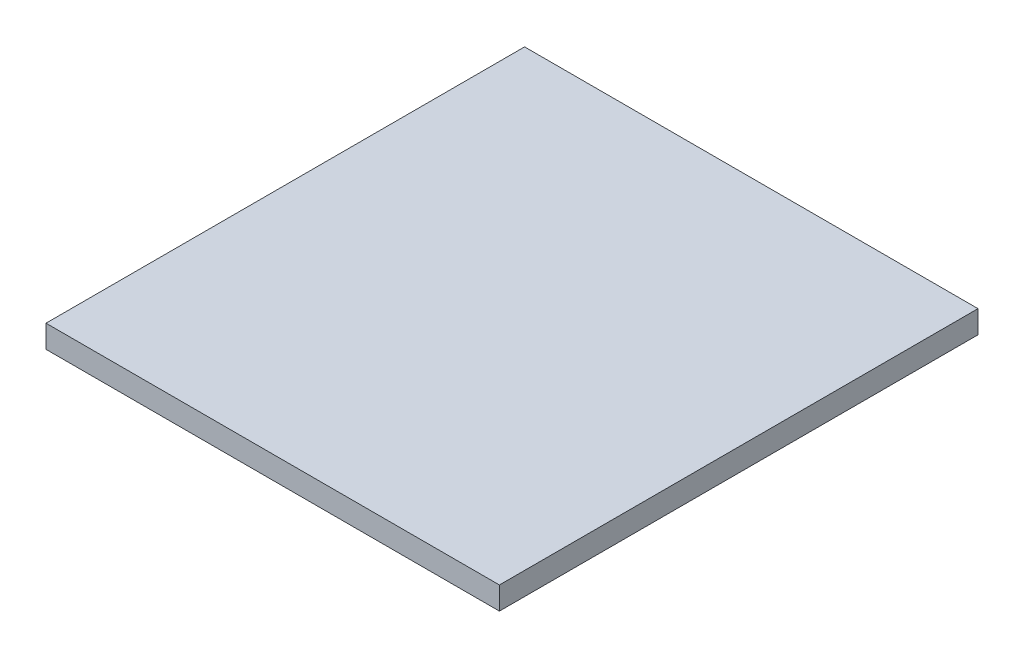
ISO-10303-21;
HEADER;
FILE_DESCRIPTION(('STEP AP214'),'2;1');
FILE_NAME('part.step','',(''),(''),'','','');
FILE_SCHEMA(('AUTOMOTIVE_DESIGN { 1 0 10303 214 1 1 1 1 }'));
ENDSEC;
DATA;
#1=APPLICATION_CONTEXT('core data for automotive mechanical design processes');
#2=APPLICATION_PROTOCOL_DEFINITION('international standard','automotive_design',2000,#1);
#3=PRODUCT_CONTEXT('',#1,'mechanical');
#4=PRODUCT('Part','Part','',(#3));
#5=PRODUCT_RELATED_PRODUCT_CATEGORY('part','',(#4));
#6=PRODUCT_DEFINITION_FORMATION('','',#4);
#7=PRODUCT_DEFINITION_CONTEXT('part definition',#1,'design');
#8=PRODUCT_DEFINITION('design','',#6,#7);
#9=PRODUCT_DEFINITION_SHAPE('','',#8);
#10=(LENGTH_UNIT() NAMED_UNIT(*) SI_UNIT(.MILLI.,.METRE.));
#11=(NAMED_UNIT(*) PLANE_ANGLE_UNIT() SI_UNIT($,.RADIAN.));
#12=(NAMED_UNIT(*) SI_UNIT($,.STERADIAN.) SOLID_ANGLE_UNIT());
#13=UNCERTAINTY_MEASURE_WITH_UNIT(LENGTH_MEASURE(1.E-05),#10,'distance_accuracy_value','');
#14=(GEOMETRIC_REPRESENTATION_CONTEXT(3) GLOBAL_UNCERTAINTY_ASSIGNED_CONTEXT((#13)) GLOBAL_UNIT_ASSIGNED_CONTEXT((#10,
#11,#12)) REPRESENTATION_CONTEXT('',''));
#15=CARTESIAN_POINT('',(0.,0.,0.));
#16=DIRECTION('',(0.,0.,1.));
#17=DIRECTION('',(1.,0.,0.));
#18=AXIS2_PLACEMENT_3D('',#15,#16,#17);
#19=CARTESIAN_POINT('',(180.,18.,-190.));
#20=DIRECTION('',(-1.,0.,0.));
#21=DIRECTION('',(0.,0.,1.));
#22=AXIS2_PLACEMENT_3D('',#19,#20,#21);
#23=PLANE('',#22);
#24=DIRECTION('',(0.,0.,-1.));
#25=VECTOR('',#24,1.);
#26=CARTESIAN_POINT('',(180.,0.,-190.));
#27=LINE('',#26,#25);
#28=CARTESIAN_POINT('',(180.,0.,190.));
#29=VERTEX_POINT('',#28);
#30=CARTESIAN_POINT('',(180.,0.,-190.));
#31=VERTEX_POINT('',#30);
#32=EDGE_CURVE('E95',#29,#31,#27,.T.);
#33=ORIENTED_EDGE('',*,*,#32,.T.);
#34=DIRECTION('',(0.,-1.,0.));
#35=VECTOR('',#34,1.);
#36=CARTESIAN_POINT('',(180.,18.,-190.));
#37=LINE('',#36,#35);
#38=CARTESIAN_POINT('',(180.,18.,-190.));
#39=VERTEX_POINT('',#38);
#40=EDGE_CURVE('E11',#39,#31,#37,.T.);
#41=ORIENTED_EDGE('',*,*,#40,.F.);
#42=DIRECTION('',(0.,0.,-1.));
#43=VECTOR('',#42,1.);
#44=CARTESIAN_POINT('',(180.,18.,-190.));
#45=LINE('',#44,#43);
#46=CARTESIAN_POINT('',(180.,18.,190.));
#47=VERTEX_POINT('',#46);
#48=EDGE_CURVE('E83',#47,#39,#45,.T.);
#49=ORIENTED_EDGE('',*,*,#48,.F.);
#50=DIRECTION('',(0.,-1.,0.));
#51=VECTOR('',#50,1.);
#52=CARTESIAN_POINT('',(180.,18.,190.));
#53=LINE('',#52,#51);
#54=EDGE_CURVE('E91',#47,#29,#53,.T.);
#55=ORIENTED_EDGE('',*,*,#54,.T.);
#56=EDGE_LOOP('',(#33,#41,#49,#55));
#57=FACE_BOUND('',#56,.T.);
#58=ADVANCED_FACE('F32',(#57),#23,.F.);
#59=CARTESIAN_POINT('',(-180.,18.,-190.));
#60=DIRECTION('',(0.,0.,1.));
#61=DIRECTION('',(1.,0.,0.));
#62=AXIS2_PLACEMENT_3D('',#59,#60,#61);
#63=PLANE('',#62);
#64=DIRECTION('',(-1.,0.,0.));
#65=VECTOR('',#64,1.);
#66=CARTESIAN_POINT('',(-180.,0.,-190.));
#67=LINE('',#66,#65);
#68=CARTESIAN_POINT('',(-180.,0.,-190.));
#69=VERTEX_POINT('',#68);
#70=EDGE_CURVE('E87',#31,#69,#67,.T.);
#71=ORIENTED_EDGE('',*,*,#70,.T.);
#72=DIRECTION('',(0.,-1.,0.));
#73=VECTOR('',#72,1.);
#74=CARTESIAN_POINT('',(-180.,18.,-190.));
#75=LINE('',#74,#73);
#76=CARTESIAN_POINT('',(-180.,18.,-190.));
#77=VERTEX_POINT('',#76);
#78=EDGE_CURVE('E40',#77,#69,#75,.T.);
#79=ORIENTED_EDGE('',*,*,#78,.F.);
#80=DIRECTION('',(-1.,0.,0.));
#81=VECTOR('',#80,1.);
#82=CARTESIAN_POINT('',(-180.,18.,-190.));
#83=LINE('',#82,#81);
#84=EDGE_CURVE('E78',#39,#77,#83,.T.);
#85=ORIENTED_EDGE('',*,*,#84,.F.);
#86=ORIENTED_EDGE('',*,*,#40,.T.);
#87=EDGE_LOOP('',(#71,#79,#85,#86));
#88=FACE_BOUND('',#87,.T.);
#89=ADVANCED_FACE('F86',(#88),#63,.F.);
#90=CARTESIAN_POINT('',(-180.,18.,-190.));
#91=DIRECTION('',(1.,0.,0.));
#92=DIRECTION('',(0.,0.,-1.));
#93=AXIS2_PLACEMENT_3D('',#90,#91,#92);
#94=PLANE('',#93);
#95=DIRECTION('',(0.,0.,1.));
#96=VECTOR('',#95,1.);
#97=CARTESIAN_POINT('',(-180.,0.,-190.));
#98=LINE('',#97,#96);
#99=CARTESIAN_POINT('',(-180.,0.,190.));
#100=VERTEX_POINT('',#99);
#101=EDGE_CURVE('E65',#69,#100,#98,.T.);
#102=ORIENTED_EDGE('',*,*,#101,.T.);
#103=DIRECTION('',(0.,-1.,0.));
#104=VECTOR('',#103,1.);
#105=CARTESIAN_POINT('',(-180.,18.,190.));
#106=LINE('',#105,#104);
#107=CARTESIAN_POINT('',(-180.,18.,190.));
#108=VERTEX_POINT('',#107);
#109=EDGE_CURVE('E88',#108,#100,#106,.T.);
#110=ORIENTED_EDGE('',*,*,#109,.F.);
#111=DIRECTION('',(0.,0.,1.));
#112=VECTOR('',#111,1.);
#113=CARTESIAN_POINT('',(-180.,18.,-190.));
#114=LINE('',#113,#112);
#115=EDGE_CURVE('E81',#77,#108,#114,.T.);
#116=ORIENTED_EDGE('',*,*,#115,.F.);
#117=ORIENTED_EDGE('',*,*,#78,.T.);
#118=EDGE_LOOP('',(#102,#110,#116,#117));
#119=FACE_BOUND('',#118,.T.);
#120=ADVANCED_FACE('F89',(#119),#94,.F.);
#121=CARTESIAN_POINT('',(-180.,18.,190.));
#122=DIRECTION('',(0.,0.,-1.));
#123=DIRECTION('',(-1.,0.,0.));
#124=AXIS2_PLACEMENT_3D('',#121,#122,#123);
#125=PLANE('',#124);
#126=DIRECTION('',(1.,0.,0.));
#127=VECTOR('',#126,1.);
#128=CARTESIAN_POINT('',(-180.,0.,190.));
#129=LINE('',#128,#127);
#130=EDGE_CURVE('E71',#100,#29,#129,.T.);
#131=ORIENTED_EDGE('',*,*,#130,.T.);
#132=ORIENTED_EDGE('',*,*,#54,.F.);
#133=DIRECTION('',(1.,0.,0.));
#134=VECTOR('',#133,1.);
#135=CARTESIAN_POINT('',(-180.,18.,190.));
#136=LINE('',#135,#134);
#137=EDGE_CURVE('E48',#108,#47,#136,.T.);
#138=ORIENTED_EDGE('',*,*,#137,.F.);
#139=ORIENTED_EDGE('',*,*,#109,.T.);
#140=EDGE_LOOP('',(#131,#132,#138,#139));
#141=FACE_BOUND('',#140,.T.);
#142=ADVANCED_FACE('F102',(#141),#125,.F.);
#143=CARTESIAN_POINT('',(0.,18.,0.));
#144=DIRECTION('',(0.,1.,0.));
#145=DIRECTION('',(0.,0.,1.));
#146=AXIS2_PLACEMENT_3D('',#143,#144,#145);
#147=PLANE('',#146);
#148=ORIENTED_EDGE('',*,*,#48,.T.);
#149=ORIENTED_EDGE('',*,*,#84,.T.);
#150=ORIENTED_EDGE('',*,*,#115,.T.);
#151=ORIENTED_EDGE('',*,*,#137,.T.);
#152=EDGE_LOOP('',(#148,#149,#150,#151));
#153=FACE_BOUND('',#152,.T.);
#154=ADVANCED_FACE('F79',(#153),#147,.T.);
#155=CARTESIAN_POINT('',(0.,0.,0.));
#156=DIRECTION('',(0.,1.,0.));
#157=DIRECTION('',(0.,0.,1.));
#158=AXIS2_PLACEMENT_3D('',#155,#156,#157);
#159=PLANE('',#158);
#160=ORIENTED_EDGE('',*,*,#32,.F.);
#161=ORIENTED_EDGE('',*,*,#130,.F.);
#162=ORIENTED_EDGE('',*,*,#101,.F.);
#163=ORIENTED_EDGE('',*,*,#70,.F.);
#164=EDGE_LOOP('',(#160,#161,#162,#163));
#165=FACE_BOUND('',#164,.T.);
#166=ADVANCED_FACE('F105',(#165),#159,.F.);
#167=CLOSED_SHELL('',(#58,#89,#120,#142,#154,#166));
#168=MANIFOLD_SOLID_BREP('B2',#167);
#169=ADVANCED_BREP_SHAPE_REPRESENTATION('',(#18,#168),#14);
#170=SHAPE_DEFINITION_REPRESENTATION(#9,#169);
ENDSEC;
END-ISO-10303-21;
